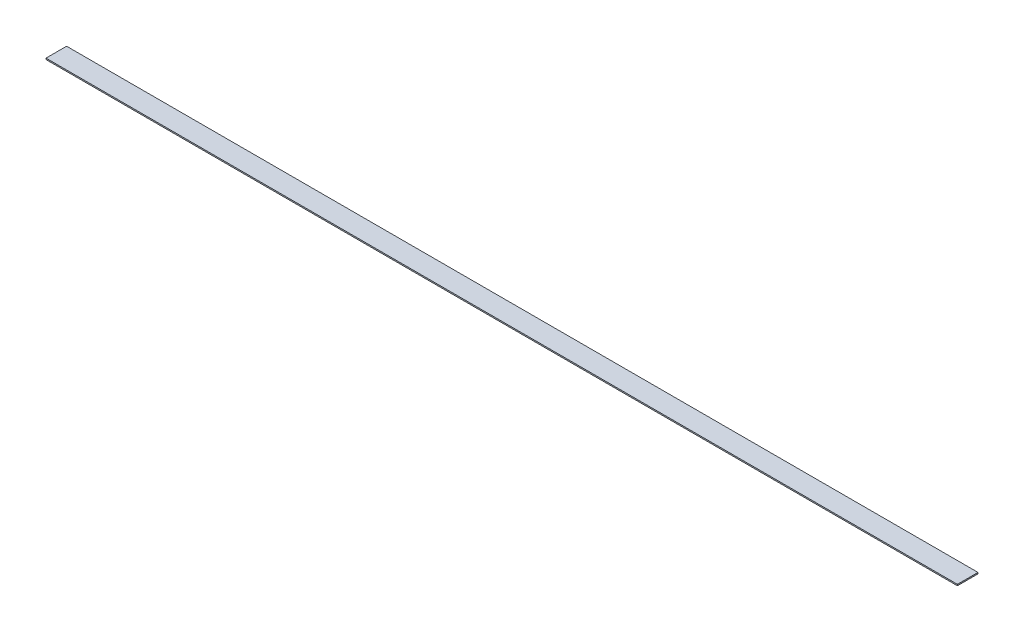
ISO-10303-21;
HEADER;
FILE_DESCRIPTION(('STEP AP214'),'2;1');
FILE_NAME('part.step','',(''),(''),'','','');
FILE_SCHEMA(('AUTOMOTIVE_DESIGN { 1 0 10303 214 1 1 1 1 }'));
ENDSEC;
DATA;
#1=APPLICATION_CONTEXT('core data for automotive mechanical design processes');
#2=APPLICATION_PROTOCOL_DEFINITION('international standard','automotive_design',2000,#1);
#3=PRODUCT_CONTEXT('',#1,'mechanical');
#4=PRODUCT('Part','Part','',(#3));
#5=PRODUCT_RELATED_PRODUCT_CATEGORY('part','',(#4));
#6=PRODUCT_DEFINITION_FORMATION('','',#4);
#7=PRODUCT_DEFINITION_CONTEXT('part definition',#1,'design');
#8=PRODUCT_DEFINITION('design','',#6,#7);
#9=PRODUCT_DEFINITION_SHAPE('','',#8);
#10=(LENGTH_UNIT() NAMED_UNIT(*) SI_UNIT(.MILLI.,.METRE.));
#11=(NAMED_UNIT(*) PLANE_ANGLE_UNIT() SI_UNIT($,.RADIAN.));
#12=(NAMED_UNIT(*) SI_UNIT($,.STERADIAN.) SOLID_ANGLE_UNIT());
#13=UNCERTAINTY_MEASURE_WITH_UNIT(LENGTH_MEASURE(1.E-05),#10,'distance_accuracy_value','');
#14=(GEOMETRIC_REPRESENTATION_CONTEXT(3) GLOBAL_UNCERTAINTY_ASSIGNED_CONTEXT((#13)) GLOBAL_UNIT_ASSIGNED_CONTEXT((#10,
#11,#12)) REPRESENTATION_CONTEXT('',''));
#15=CARTESIAN_POINT('',(0.,0.,0.));
#16=DIRECTION('',(0.,0.,1.));
#17=DIRECTION('',(1.,0.,0.));
#18=AXIS2_PLACEMENT_3D('',#15,#16,#17);
#19=CARTESIAN_POINT('',(0.,3.175,0.));
#20=DIRECTION('',(1.,0.,0.));
#21=DIRECTION('',(0.,0.,-1.));
#22=AXIS2_PLACEMENT_3D('',#19,#20,#21);
#23=PLANE('',#22);
#24=DIRECTION('',(0.,0.,1.));
#25=VECTOR('',#24,1.);
#26=CARTESIAN_POINT('',(0.,0.,0.));
#27=LINE('',#26,#25);
#28=CARTESIAN_POINT('',(0.,0.,-50.8));
#29=VERTEX_POINT('',#28);
#30=CARTESIAN_POINT('',(0.,0.,0.));
#31=VERTEX_POINT('',#30);
#32=EDGE_CURVE('E96',#29,#31,#27,.T.);
#33=ORIENTED_EDGE('',*,*,#32,.T.);
#34=DIRECTION('',(0.,-1.,0.));
#35=VECTOR('',#34,1.);
#36=CARTESIAN_POINT('',(0.,3.175,0.));
#37=LINE('',#36,#35);
#38=CARTESIAN_POINT('',(0.,3.175,0.));
#39=VERTEX_POINT('',#38);
#40=EDGE_CURVE('E11',#39,#31,#37,.T.);
#41=ORIENTED_EDGE('',*,*,#40,.F.);
#42=DIRECTION('',(0.,0.,1.));
#43=VECTOR('',#42,1.);
#44=CARTESIAN_POINT('',(0.,3.175,0.));
#45=LINE('',#44,#43);
#46=CARTESIAN_POINT('',(0.,3.175,-50.8));
#47=VERTEX_POINT('',#46);
#48=EDGE_CURVE('E84',#47,#39,#45,.T.);
#49=ORIENTED_EDGE('',*,*,#48,.F.);
#50=DIRECTION('',(0.,-1.,0.));
#51=VECTOR('',#50,1.);
#52=CARTESIAN_POINT('',(0.,3.175,-50.8));
#53=LINE('',#52,#51);
#54=EDGE_CURVE('E92',#47,#29,#53,.T.);
#55=ORIENTED_EDGE('',*,*,#54,.T.);
#56=EDGE_LOOP('',(#33,#41,#49,#55));
#57=FACE_BOUND('',#56,.T.);
#58=ADVANCED_FACE('F33',(#57),#23,.F.);
#59=CARTESIAN_POINT('',(0.,3.175,0.));
#60=DIRECTION('',(0.,0.,-1.));
#61=DIRECTION('',(-1.,0.,0.));
#62=AXIS2_PLACEMENT_3D('',#59,#60,#61);
#63=PLANE('',#62);
#64=DIRECTION('',(1.,0.,0.));
#65=VECTOR('',#64,1.);
#66=CARTESIAN_POINT('',(0.,0.,0.));
#67=LINE('',#66,#65);
#68=CARTESIAN_POINT('',(2247.9,0.,0.));
#69=VERTEX_POINT('',#68);
#70=EDGE_CURVE('E88',#31,#69,#67,.T.);
#71=ORIENTED_EDGE('',*,*,#70,.T.);
#72=DIRECTION('',(0.,-1.,0.));
#73=VECTOR('',#72,1.);
#74=CARTESIAN_POINT('',(2247.9,3.175,0.));
#75=LINE('',#74,#73);
#76=CARTESIAN_POINT('',(2247.9,3.175,0.));
#77=VERTEX_POINT('',#76);
#78=EDGE_CURVE('E41',#77,#69,#75,.T.);
#79=ORIENTED_EDGE('',*,*,#78,.F.);
#80=DIRECTION('',(1.,0.,0.));
#81=VECTOR('',#80,1.);
#82=CARTESIAN_POINT('',(0.,3.175,0.));
#83=LINE('',#82,#81);
#84=EDGE_CURVE('E79',#39,#77,#83,.T.);
#85=ORIENTED_EDGE('',*,*,#84,.F.);
#86=ORIENTED_EDGE('',*,*,#40,.T.);
#87=EDGE_LOOP('',(#71,#79,#85,#86));
#88=FACE_BOUND('',#87,.T.);
#89=ADVANCED_FACE('F87',(#88),#63,.F.);
#90=CARTESIAN_POINT('',(2247.9,3.175,0.));
#91=DIRECTION('',(-1.,0.,0.));
#92=DIRECTION('',(0.,0.,1.));
#93=AXIS2_PLACEMENT_3D('',#90,#91,#92);
#94=PLANE('',#93);
#95=DIRECTION('',(0.,0.,-1.));
#96=VECTOR('',#95,1.);
#97=CARTESIAN_POINT('',(2247.9,0.,0.));
#98=LINE('',#97,#96);
#99=CARTESIAN_POINT('',(2247.9,0.,-50.8));
#100=VERTEX_POINT('',#99);
#101=EDGE_CURVE('E66',#69,#100,#98,.T.);
#102=ORIENTED_EDGE('',*,*,#101,.T.);
#103=DIRECTION('',(0.,-1.,0.));
#104=VECTOR('',#103,1.);
#105=CARTESIAN_POINT('',(2247.9,3.175,-50.8));
#106=LINE('',#105,#104);
#107=CARTESIAN_POINT('',(2247.9,3.175,-50.8));
#108=VERTEX_POINT('',#107);
#109=EDGE_CURVE('E89',#108,#100,#106,.T.);
#110=ORIENTED_EDGE('',*,*,#109,.F.);
#111=DIRECTION('',(0.,0.,-1.));
#112=VECTOR('',#111,1.);
#113=CARTESIAN_POINT('',(2247.9,3.175,0.));
#114=LINE('',#113,#112);
#115=EDGE_CURVE('E82',#77,#108,#114,.T.);
#116=ORIENTED_EDGE('',*,*,#115,.F.);
#117=ORIENTED_EDGE('',*,*,#78,.T.);
#118=EDGE_LOOP('',(#102,#110,#116,#117));
#119=FACE_BOUND('',#118,.T.);
#120=ADVANCED_FACE('F90',(#119),#94,.F.);
#121=CARTESIAN_POINT('',(0.,3.175,-50.8));
#122=DIRECTION('',(0.,0.,1.));
#123=DIRECTION('',(1.,0.,0.));
#124=AXIS2_PLACEMENT_3D('',#121,#122,#123);
#125=PLANE('',#124);
#126=DIRECTION('',(-1.,0.,0.));
#127=VECTOR('',#126,1.);
#128=CARTESIAN_POINT('',(0.,0.,-50.8));
#129=LINE('',#128,#127);
#130=EDGE_CURVE('E72',#100,#29,#129,.T.);
#131=ORIENTED_EDGE('',*,*,#130,.T.);
#132=ORIENTED_EDGE('',*,*,#54,.F.);
#133=DIRECTION('',(-1.,0.,0.));
#134=VECTOR('',#133,1.);
#135=CARTESIAN_POINT('',(0.,3.175,-50.8));
#136=LINE('',#135,#134);
#137=EDGE_CURVE('E49',#108,#47,#136,.T.);
#138=ORIENTED_EDGE('',*,*,#137,.F.);
#139=ORIENTED_EDGE('',*,*,#109,.T.);
#140=EDGE_LOOP('',(#131,#132,#138,#139));
#141=FACE_BOUND('',#140,.T.);
#142=ADVANCED_FACE('F103',(#141),#125,.F.);
#143=CARTESIAN_POINT('',(0.,3.175,0.));
#144=DIRECTION('',(0.,-1.,0.));
#145=DIRECTION('',(0.,0.,-1.));
#146=AXIS2_PLACEMENT_3D('',#143,#144,#145);
#147=PLANE('',#146);
#148=ORIENTED_EDGE('',*,*,#48,.T.);
#149=ORIENTED_EDGE('',*,*,#84,.T.);
#150=ORIENTED_EDGE('',*,*,#115,.T.);
#151=ORIENTED_EDGE('',*,*,#137,.T.);
#152=EDGE_LOOP('',(#148,#149,#150,#151));
#153=FACE_BOUND('',#152,.T.);
#154=ADVANCED_FACE('F80',(#153),#147,.F.);
#155=CARTESIAN_POINT('',(0.,0.,0.));
#156=DIRECTION('',(0.,-1.,0.));
#157=DIRECTION('',(0.,0.,-1.));
#158=AXIS2_PLACEMENT_3D('',#155,#156,#157);
#159=PLANE('',#158);
#160=ORIENTED_EDGE('',*,*,#32,.F.);
#161=ORIENTED_EDGE('',*,*,#130,.F.);
#162=ORIENTED_EDGE('',*,*,#101,.F.);
#163=ORIENTED_EDGE('',*,*,#70,.F.);
#164=EDGE_LOOP('',(#160,#161,#162,#163));
#165=FACE_BOUND('',#164,.T.);
#166=ADVANCED_FACE('F106',(#165),#159,.T.);
#167=CLOSED_SHELL('',(#58,#89,#120,#142,#154,#166));
#168=MANIFOLD_SOLID_BREP('B2',#167);
#169=ADVANCED_BREP_SHAPE_REPRESENTATION('',(#18,#168),#14);
#170=SHAPE_DEFINITION_REPRESENTATION(#9,#169);
ENDSEC;
END-ISO-10303-21;
